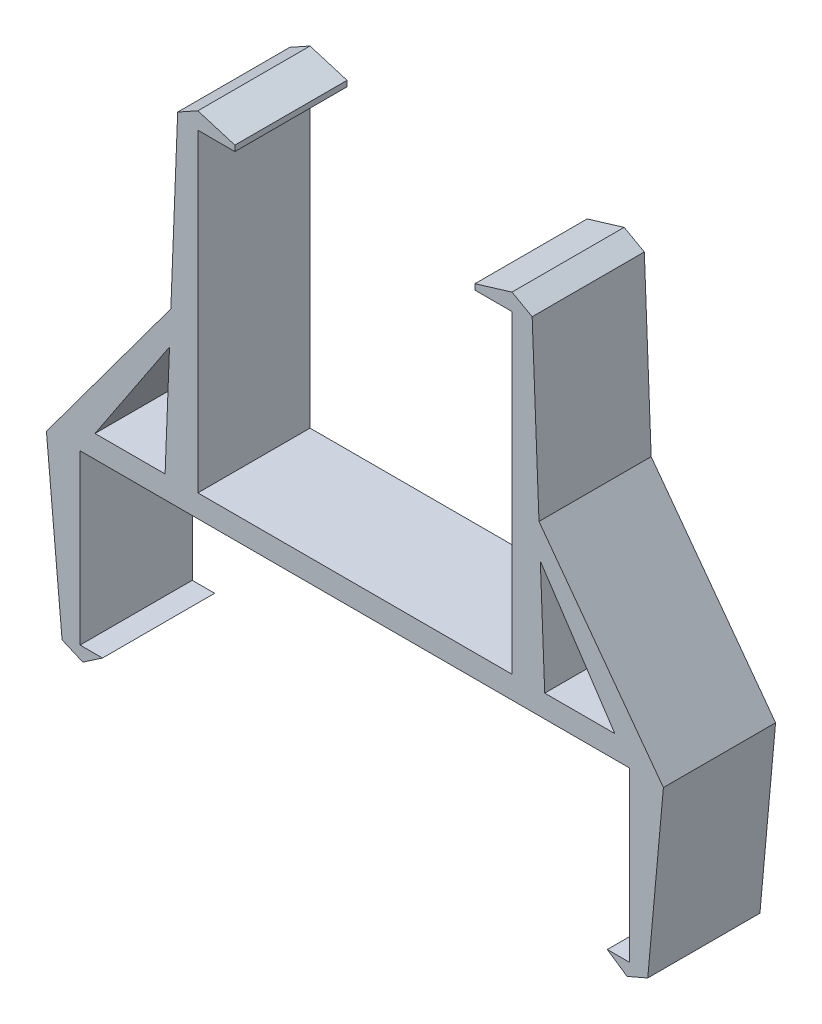
ISO-10303-21;
HEADER;
FILE_DESCRIPTION(('STEP AP214'),'2;1');
FILE_NAME('part.step','',(''),(''),'','','');
FILE_SCHEMA(('AUTOMOTIVE_DESIGN { 1 0 10303 214 1 1 1 1 }'));
ENDSEC;
DATA;
#1=APPLICATION_CONTEXT('core data for automotive mechanical design processes');
#2=APPLICATION_PROTOCOL_DEFINITION('international standard','automotive_design',2000,#1);
#3=PRODUCT_CONTEXT('',#1,'mechanical');
#4=PRODUCT('Part','Part','',(#3));
#5=PRODUCT_RELATED_PRODUCT_CATEGORY('part','',(#4));
#6=PRODUCT_DEFINITION_FORMATION('','',#4);
#7=PRODUCT_DEFINITION_CONTEXT('part definition',#1,'design');
#8=PRODUCT_DEFINITION('design','',#6,#7);
#9=PRODUCT_DEFINITION_SHAPE('','',#8);
#10=(LENGTH_UNIT() NAMED_UNIT(*) SI_UNIT(.MILLI.,.METRE.));
#11=(NAMED_UNIT(*) PLANE_ANGLE_UNIT() SI_UNIT($,.RADIAN.));
#12=(NAMED_UNIT(*) SI_UNIT($,.STERADIAN.) SOLID_ANGLE_UNIT());
#13=UNCERTAINTY_MEASURE_WITH_UNIT(LENGTH_MEASURE(1.E-05),#10,'distance_accuracy_value','');
#14=(GEOMETRIC_REPRESENTATION_CONTEXT(3) GLOBAL_UNCERTAINTY_ASSIGNED_CONTEXT((#13)) GLOBAL_UNIT_ASSIGNED_CONTEXT((#10,
#11,#12)) REPRESENTATION_CONTEXT('',''));
#15=CARTESIAN_POINT('',(0.,0.,0.));
#16=DIRECTION('',(0.,0.,1.));
#17=DIRECTION('',(1.,0.,0.));
#18=AXIS2_PLACEMENT_3D('',#15,#16,#17);
#19=CARTESIAN_POINT('',(30.8735201622857,1.21469587523747,10.));
#20=DIRECTION('',(0.999226911934952,0.0393138457154735,0.));
#21=DIRECTION('',(-0.0393138457154735,0.999226911934952,0.));
#22=AXIS2_PLACEMENT_3D('',#19,#20,#21);
#23=PLANE('',#22);
#24=DIRECTION('',(0.0393138457154735,-0.999226911934952,0.));
#25=VECTOR('',#24,1.);
#26=CARTESIAN_POINT('',(30.8735201622857,1.21469587523747,10.));
#27=LINE('',#26,#25);
#28=CARTESIAN_POINT('',(30.527868852459,10.,10.));
#29=VERTEX_POINT('',#28);
#30=CARTESIAN_POINT('',(30.9213114754098,0.,10.));
#31=VERTEX_POINT('',#30);
#32=EDGE_CURVE('E275',#29,#31,#27,.T.);
#33=ORIENTED_EDGE('',*,*,#32,.T.);
#34=DIRECTION('',(0.,0.,-1.));
#35=VECTOR('',#34,1.);
#36=CARTESIAN_POINT('',(30.9213114754098,0.,10.));
#37=LINE('',#36,#35);
#38=CARTESIAN_POINT('',(30.9213114754098,0.,0.));
#39=VERTEX_POINT('',#38);
#40=EDGE_CURVE('E255',#31,#39,#37,.T.);
#41=ORIENTED_EDGE('',*,*,#40,.T.);
#42=DIRECTION('',(0.0393138457154735,-0.999226911934952,0.));
#43=VECTOR('',#42,1.);
#44=CARTESIAN_POINT('',(30.8735201622857,1.21469587523747,0.));
#45=LINE('',#44,#43);
#46=CARTESIAN_POINT('',(30.527868852459,10.,0.));
#47=VERTEX_POINT('',#46);
#48=EDGE_CURVE('E484',#47,#39,#45,.T.);
#49=ORIENTED_EDGE('',*,*,#48,.F.);
#50=DIRECTION('',(0.,0.,-1.));
#51=VECTOR('',#50,1.);
#52=CARTESIAN_POINT('',(30.527868852459,10.,10.));
#53=LINE('',#52,#51);
#54=EDGE_CURVE('E341',#29,#47,#53,.T.);
#55=ORIENTED_EDGE('',*,*,#54,.F.);
#56=EDGE_LOOP('',(#33,#41,#49,#55));
#57=FACE_BOUND('',#56,.T.);
#58=ADVANCED_FACE('F41',(#57),#23,.T.);
#59=CARTESIAN_POINT('',(25.7891743163955,17.132889986425,10.));
#60=DIRECTION('',(0.832942029592769,0.553360258184376,0.));
#61=DIRECTION('',(-0.553360258184376,0.832942029592769,0.));
#62=AXIS2_PLACEMENT_3D('',#59,#60,#61);
#63=PLANE('',#62);
#64=DIRECTION('',(0.,0.,-1.));
#65=VECTOR('',#64,1.);
#66=CARTESIAN_POINT('',(37.1713114754089,1.49651624892979E-12,10.));
#67=LINE('',#66,#65);
#68=CARTESIAN_POINT('',(37.1713114754089,1.49651624892979E-12,10.));
#69=VERTEX_POINT('',#68);
#70=CARTESIAN_POINT('',(37.1713114754089,1.49651624892979E-12,0.));
#71=VERTEX_POINT('',#70);
#72=EDGE_CURVE('E252',#69,#71,#67,.T.);
#73=ORIENTED_EDGE('',*,*,#72,.F.);
#74=DIRECTION('',(0.553360258184376,-0.832942029592769,0.));
#75=VECTOR('',#74,1.);
#76=CARTESIAN_POINT('',(25.7891743163955,17.132889986425,10.));
#77=LINE('',#76,#75);
#78=EDGE_CURVE('E266',#29,#69,#77,.T.);
#79=ORIENTED_EDGE('',*,*,#78,.F.);
#80=ORIENTED_EDGE('',*,*,#54,.T.);
#81=DIRECTION('',(0.553360258184376,-0.832942029592769,0.));
#82=VECTOR('',#81,1.);
#83=CARTESIAN_POINT('',(25.7891743163955,17.132889986425,0.));
#84=LINE('',#83,#82);
#85=EDGE_CURVE('E269',#47,#71,#84,.T.);
#86=ORIENTED_EDGE('',*,*,#85,.T.);
#87=EDGE_LOOP('',(#73,#79,#80,#86));
#88=FACE_BOUND('',#87,.T.);
#89=ADVANCED_FACE('F265',(#88),#63,.F.);
#90=CARTESIAN_POINT('',(29.8,28.5,10.));
#91=VERTEX_POINT('',#90);
#92=CARTESIAN_POINT('',(30.4098360655738,13.,10.));
#93=VERTEX_POINT('',#92);
#94=EDGE_CURVE('E433',#91,#93,#27,.T.);
#95=ORIENTED_EDGE('',*,*,#94,.T.);
#96=DIRECTION('',(0.,0.,-1.));
#97=VECTOR('',#96,1.);
#98=CARTESIAN_POINT('',(30.4098360655738,13.,10.));
#99=LINE('',#98,#97);
#100=CARTESIAN_POINT('',(30.4098360655738,13.,0.));
#101=VERTEX_POINT('',#100);
#102=EDGE_CURVE('E344',#93,#101,#99,.T.);
#103=ORIENTED_EDGE('',*,*,#102,.T.);
#104=CARTESIAN_POINT('',(29.8,28.5,0.));
#105=VERTEX_POINT('',#104);
#106=EDGE_CURVE('E485',#105,#101,#45,.T.);
#107=ORIENTED_EDGE('',*,*,#106,.F.);
#108=DIRECTION('',(0.,0.,-1.));
#109=VECTOR('',#108,1.);
#110=CARTESIAN_POINT('',(29.8,28.5,10.));
#111=LINE('',#110,#109);
#112=EDGE_CURVE('E11',#91,#105,#111,.T.);
#113=ORIENTED_EDGE('',*,*,#112,.F.);
#114=EDGE_LOOP('',(#95,#103,#107,#113));
#115=FACE_BOUND('',#114,.T.);
#116=ADVANCED_FACE('F591',(#115),#23,.T.);
#117=CARTESIAN_POINT('',(-2.91679635930406,0.114759201021799,10.));
#118=DIRECTION('',(0.999226911934952,-0.0393138457154735,0.));
#119=DIRECTION('',(0.0393138457154735,0.999226911934952,0.));
#120=AXIS2_PLACEMENT_3D('',#117,#118,#119);
#121=PLANE('',#120);
#122=DIRECTION('',(0.,0.,-1.));
#123=VECTOR('',#122,1.);
#124=CARTESIAN_POINT('',(-2.40983606557377,13.,10.));
#125=LINE('',#124,#123);
#126=CARTESIAN_POINT('',(-2.40983606557377,13.,10.));
#127=VERTEX_POINT('',#126);
#128=CARTESIAN_POINT('',(-2.40983606557377,13.,0.));
#129=VERTEX_POINT('',#128);
#130=EDGE_CURVE('E404',#127,#129,#125,.T.);
#131=ORIENTED_EDGE('',*,*,#130,.F.);
#132=DIRECTION('',(-0.0393138457154735,-0.999226911934952,0.));
#133=VECTOR('',#132,1.);
#134=CARTESIAN_POINT('',(-2.91679635930406,0.114759201021799,10.));
#135=LINE('',#134,#133);
#136=CARTESIAN_POINT('',(-1.8,28.5,10.));
#137=VERTEX_POINT('',#136);
#138=EDGE_CURVE('E477',#137,#127,#135,.T.);
#139=ORIENTED_EDGE('',*,*,#138,.F.);
#140=DIRECTION('',(0.,0.,-1.));
#141=VECTOR('',#140,1.);
#142=CARTESIAN_POINT('',(-1.8,28.5,10.));
#143=LINE('',#142,#141);
#144=CARTESIAN_POINT('',(-1.8,28.5,0.));
#145=VERTEX_POINT('',#144);
#146=EDGE_CURVE('E481',#137,#145,#143,.T.);
#147=ORIENTED_EDGE('',*,*,#146,.T.);
#148=DIRECTION('',(-0.0393138457154735,-0.999226911934952,0.));
#149=VECTOR('',#148,1.);
#150=CARTESIAN_POINT('',(-2.91679635930406,0.114759201021799,0.));
#151=LINE('',#150,#149);
#152=EDGE_CURVE('E432',#145,#129,#151,.T.);
#153=ORIENTED_EDGE('',*,*,#152,.T.);
#154=EDGE_LOOP('',(#131,#139,#147,#153));
#155=FACE_BOUND('',#154,.T.);
#156=ADVANCED_FACE('F648',(#155),#121,.F.);
#157=CARTESIAN_POINT('',(0.,-2.,10.));
#158=DIRECTION('',(0.,1.,0.));
#159=DIRECTION('',(0.,0.,1.));
#160=AXIS2_PLACEMENT_3D('',#157,#158,#159);
#161=PLANE('',#160);
#162=DIRECTION('',(1.,0.,0.));
#163=VECTOR('',#162,1.);
#164=CARTESIAN_POINT('',(0.,-2.,0.));
#165=LINE('',#164,#163);
#166=CARTESIAN_POINT('',(-10.5,-2.,0.));
#167=VERTEX_POINT('',#166);
#168=CARTESIAN_POINT('',(38.5,-1.99999999999999,0.));
#169=VERTEX_POINT('',#168);
#170=EDGE_CURVE('E428',#167,#169,#165,.T.);
#171=ORIENTED_EDGE('',*,*,#170,.T.);
#172=DIRECTION('',(0.,0.,-1.));
#173=VECTOR('',#172,1.);
#174=CARTESIAN_POINT('',(38.5,-1.99999999999999,10.));
#175=LINE('',#174,#173);
#176=CARTESIAN_POINT('',(38.5,-1.99999999999999,10.));
#177=VERTEX_POINT('',#176);
#178=EDGE_CURVE('E337',#177,#169,#175,.T.);
#179=ORIENTED_EDGE('',*,*,#178,.F.);
#180=DIRECTION('',(1.,0.,0.));
#181=VECTOR('',#180,1.);
#182=CARTESIAN_POINT('',(0.,-2.,10.));
#183=LINE('',#182,#181);
#184=CARTESIAN_POINT('',(-10.5,-2.,10.));
#185=VERTEX_POINT('',#184);
#186=EDGE_CURVE('E429',#185,#177,#183,.T.);
#187=ORIENTED_EDGE('',*,*,#186,.F.);
#188=DIRECTION('',(0.,0.,-1.));
#189=VECTOR('',#188,1.);
#190=CARTESIAN_POINT('',(-10.5,-2.,10.));
#191=LINE('',#190,#189);
#192=EDGE_CURVE('E410',#185,#167,#191,.T.);
#193=ORIENTED_EDGE('',*,*,#192,.T.);
#194=EDGE_LOOP('',(#171,#179,#187,#193));
#195=FACE_BOUND('',#194,.T.);
#196=ADVANCED_FACE('F43',(#195),#161,.F.);
#197=CARTESIAN_POINT('',(19.127358490566,34.4292452830189,10.));
#198=DIRECTION('',(-0.485642931178631,-0.874157276121539,0.));
#199=DIRECTION('',(0.874157276121539,-0.485642931178631,0.));
#200=AXIS2_PLACEMENT_3D('',#197,#198,#199);
#201=PLANE('',#200);
#202=DIRECTION('',(-0.874157276121539,0.485642931178631,0.));
#203=VECTOR('',#202,1.);
#204=CARTESIAN_POINT('',(19.127358490566,34.4292452830189,0.));
#205=LINE('',#204,#203);
#206=CARTESIAN_POINT('',(28.,29.5,0.));
#207=VERTEX_POINT('',#206);
#208=EDGE_CURVE('E489',#105,#207,#205,.T.);
#209=ORIENTED_EDGE('',*,*,#208,.T.);
#210=DIRECTION('',(0.,0.,-1.));
#211=VECTOR('',#210,1.);
#212=CARTESIAN_POINT('',(28.,29.5,10.));
#213=LINE('',#212,#211);
#214=CARTESIAN_POINT('',(28.,29.5,10.));
#215=VERTEX_POINT('',#214);
#216=EDGE_CURVE('E50',#215,#207,#213,.T.);
#217=ORIENTED_EDGE('',*,*,#216,.F.);
#218=DIRECTION('',(-0.874157276121539,0.485642931178631,0.));
#219=VECTOR('',#218,1.);
#220=CARTESIAN_POINT('',(19.127358490566,34.4292452830189,10.));
#221=LINE('',#220,#219);
#222=EDGE_CURVE('E437',#91,#215,#221,.T.);
#223=ORIENTED_EDGE('',*,*,#222,.F.);
#224=ORIENTED_EDGE('',*,*,#112,.T.);
#225=EDGE_LOOP('',(#209,#217,#223,#224));
#226=FACE_BOUND('',#225,.T.);
#227=ADVANCED_FACE('F573',(#226),#201,.F.);
#228=CARTESIAN_POINT('',(-5.83263246425568,19.2476871320437,10.));
#229=DIRECTION('',(-0.290007395282871,0.957024404433473,0.));
#230=DIRECTION('',(-0.957024404433473,-0.290007395282871,0.));
#231=AXIS2_PLACEMENT_3D('',#228,#229,#230);
#232=PLANE('',#231);
#233=DIRECTION('',(0.957024404433473,0.290007395282871,0.));
#234=VECTOR('',#233,1.);
#235=CARTESIAN_POINT('',(-5.83263246425568,19.2476871320437,0.));
#236=LINE('',#235,#234);
#237=CARTESIAN_POINT('',(24.7,28.5,0.));
#238=VERTEX_POINT('',#237);
#239=EDGE_CURVE('E493',#238,#207,#236,.T.);
#240=ORIENTED_EDGE('',*,*,#239,.F.);
#241=DIRECTION('',(0.,0.,-1.));
#242=VECTOR('',#241,1.);
#243=CARTESIAN_POINT('',(24.7,28.5,10.));
#244=LINE('',#243,#242);
#245=CARTESIAN_POINT('',(24.7,28.5,10.));
#246=VERTEX_POINT('',#245);
#247=EDGE_CURVE('E562',#246,#238,#244,.T.);
#248=ORIENTED_EDGE('',*,*,#247,.F.);
#249=DIRECTION('',(0.957024404433473,0.290007395282871,0.));
#250=VECTOR('',#249,1.);
#251=CARTESIAN_POINT('',(-5.83263246425568,19.2476871320437,10.));
#252=LINE('',#251,#250);
#253=EDGE_CURVE('E440',#246,#215,#252,.T.);
#254=ORIENTED_EDGE('',*,*,#253,.T.);
#255=ORIENTED_EDGE('',*,*,#216,.T.);
#256=EDGE_LOOP('',(#240,#248,#254,#255));
#257=FACE_BOUND('',#256,.T.);
#258=ADVANCED_FACE('F568',(#257),#232,.T.);
#259=CARTESIAN_POINT('',(24.7,0.,10.));
#260=DIRECTION('',(-1.,0.,0.));
#261=DIRECTION('',(0.,0.,1.));
#262=AXIS2_PLACEMENT_3D('',#259,#260,#261);
#263=PLANE('',#262);
#264=DIRECTION('',(0.,1.,0.));
#265=VECTOR('',#264,1.);
#266=CARTESIAN_POINT('',(24.7,0.,0.));
#267=LINE('',#266,#265);
#268=CARTESIAN_POINT('',(24.7,28.,0.));
#269=VERTEX_POINT('',#268);
#270=EDGE_CURVE('E497',#269,#238,#267,.T.);
#271=ORIENTED_EDGE('',*,*,#270,.F.);
#272=DIRECTION('',(0.,0.,-1.));
#273=VECTOR('',#272,1.);
#274=CARTESIAN_POINT('',(24.7,28.,10.));
#275=LINE('',#274,#273);
#276=CARTESIAN_POINT('',(24.7,28.,10.));
#277=VERTEX_POINT('',#276);
#278=EDGE_CURVE('E559',#277,#269,#275,.T.);
#279=ORIENTED_EDGE('',*,*,#278,.F.);
#280=DIRECTION('',(0.,1.,0.));
#281=VECTOR('',#280,1.);
#282=CARTESIAN_POINT('',(24.7,0.,10.));
#283=LINE('',#282,#281);
#284=EDGE_CURVE('E444',#277,#246,#283,.T.);
#285=ORIENTED_EDGE('',*,*,#284,.T.);
#286=ORIENTED_EDGE('',*,*,#247,.T.);
#287=EDGE_LOOP('',(#271,#279,#285,#286));
#288=FACE_BOUND('',#287,.T.);
#289=ADVANCED_FACE('F582',(#288),#263,.T.);
#290=CARTESIAN_POINT('',(0.,28.,10.));
#291=DIRECTION('',(0.,-1.,0.));
#292=DIRECTION('',(1.,0.,0.));
#293=AXIS2_PLACEMENT_3D('',#290,#291,#292);
#294=PLANE('',#293);
#295=DIRECTION('',(-1.,0.,0.));
#296=VECTOR('',#295,1.);
#297=CARTESIAN_POINT('',(0.,28.,0.));
#298=LINE('',#297,#296);
#299=CARTESIAN_POINT('',(28.,28.,0.));
#300=VERTEX_POINT('',#299);
#301=EDGE_CURVE('E501',#300,#269,#298,.T.);
#302=ORIENTED_EDGE('',*,*,#301,.F.);
#303=DIRECTION('',(0.,0.,-1.));
#304=VECTOR('',#303,1.);
#305=CARTESIAN_POINT('',(28.,28.,10.));
#306=LINE('',#305,#304);
#307=CARTESIAN_POINT('',(28.,28.,10.));
#308=VERTEX_POINT('',#307);
#309=EDGE_CURVE('E556',#308,#300,#306,.T.);
#310=ORIENTED_EDGE('',*,*,#309,.F.);
#311=DIRECTION('',(-1.,0.,0.));
#312=VECTOR('',#311,1.);
#313=CARTESIAN_POINT('',(0.,28.,10.));
#314=LINE('',#313,#312);
#315=EDGE_CURVE('E448',#308,#277,#314,.T.);
#316=ORIENTED_EDGE('',*,*,#315,.T.);
#317=ORIENTED_EDGE('',*,*,#278,.T.);
#318=EDGE_LOOP('',(#302,#310,#316,#317));
#319=FACE_BOUND('',#318,.T.);
#320=ADVANCED_FACE('F681',(#319),#294,.T.);
#321=CARTESIAN_POINT('',(28.,0.,10.));
#322=DIRECTION('',(-1.,0.,0.));
#323=DIRECTION('',(0.,0.,1.));
#324=AXIS2_PLACEMENT_3D('',#321,#322,#323);
#325=PLANE('',#324);
#326=DIRECTION('',(0.,1.,0.));
#327=VECTOR('',#326,1.);
#328=CARTESIAN_POINT('',(28.,0.,0.));
#329=LINE('',#328,#327);
#330=CARTESIAN_POINT('',(28.,0.,0.));
#331=VERTEX_POINT('',#330);
#332=EDGE_CURVE('E505',#331,#300,#329,.T.);
#333=ORIENTED_EDGE('',*,*,#332,.F.);
#334=DIRECTION('',(0.,0.,-1.));
#335=VECTOR('',#334,1.);
#336=CARTESIAN_POINT('',(28.,0.,10.));
#337=LINE('',#336,#335);
#338=CARTESIAN_POINT('',(28.,0.,10.));
#339=VERTEX_POINT('',#338);
#340=EDGE_CURVE('E553',#339,#331,#337,.T.);
#341=ORIENTED_EDGE('',*,*,#340,.F.);
#342=DIRECTION('',(0.,1.,0.));
#343=VECTOR('',#342,1.);
#344=CARTESIAN_POINT('',(28.,0.,10.));
#345=LINE('',#344,#343);
#346=EDGE_CURVE('E452',#339,#308,#345,.T.);
#347=ORIENTED_EDGE('',*,*,#346,.T.);
#348=ORIENTED_EDGE('',*,*,#309,.T.);
#349=EDGE_LOOP('',(#333,#341,#347,#348));
#350=FACE_BOUND('',#349,.T.);
#351=ADVANCED_FACE('F679',(#350),#325,.T.);
#352=CARTESIAN_POINT('',(0.,0.,10.));
#353=DIRECTION('',(0.,1.,0.));
#354=DIRECTION('',(0.,0.,1.));
#355=AXIS2_PLACEMENT_3D('',#352,#353,#354);
#356=PLANE('',#355);
#357=DIRECTION('',(1.,0.,0.));
#358=VECTOR('',#357,1.);
#359=CARTESIAN_POINT('',(0.,0.,0.));
#360=LINE('',#359,#358);
#361=CARTESIAN_POINT('',(0.,0.,0.));
#362=VERTEX_POINT('',#361);
#363=EDGE_CURVE('E509',#362,#331,#360,.T.);
#364=ORIENTED_EDGE('',*,*,#363,.F.);
#365=DIRECTION('',(0.,0.,-1.));
#366=VECTOR('',#365,1.);
#367=CARTESIAN_POINT('',(0.,0.,10.));
#368=LINE('',#367,#366);
#369=CARTESIAN_POINT('',(0.,0.,10.));
#370=VERTEX_POINT('',#369);
#371=EDGE_CURVE('E550',#370,#362,#368,.T.);
#372=ORIENTED_EDGE('',*,*,#371,.F.);
#373=DIRECTION('',(1.,0.,0.));
#374=VECTOR('',#373,1.);
#375=CARTESIAN_POINT('',(0.,0.,10.));
#376=LINE('',#375,#374);
#377=EDGE_CURVE('E456',#370,#339,#376,.T.);
#378=ORIENTED_EDGE('',*,*,#377,.T.);
#379=ORIENTED_EDGE('',*,*,#340,.T.);
#380=EDGE_LOOP('',(#364,#372,#378,#379));
#381=FACE_BOUND('',#380,.T.);
#382=ADVANCED_FACE('F673',(#381),#356,.T.);
#383=CARTESIAN_POINT('',(0.,0.,10.));
#384=DIRECTION('',(-1.,0.,0.));
#385=DIRECTION('',(0.,0.,1.));
#386=AXIS2_PLACEMENT_3D('',#383,#384,#385);
#387=PLANE('',#386);
#388=DIRECTION('',(0.,1.,0.));
#389=VECTOR('',#388,1.);
#390=CARTESIAN_POINT('',(0.,0.,0.));
#391=LINE('',#390,#389);
#392=CARTESIAN_POINT('',(0.,28.,0.));
#393=VERTEX_POINT('',#392);
#394=EDGE_CURVE('E513',#362,#393,#391,.T.);
#395=ORIENTED_EDGE('',*,*,#394,.T.);
#396=DIRECTION('',(0.,0.,-1.));
#397=VECTOR('',#396,1.);
#398=CARTESIAN_POINT('',(0.,28.,10.));
#399=LINE('',#398,#397);
#400=CARTESIAN_POINT('',(0.,28.,10.));
#401=VERTEX_POINT('',#400);
#402=EDGE_CURVE('E546',#401,#393,#399,.T.);
#403=ORIENTED_EDGE('',*,*,#402,.F.);
#404=DIRECTION('',(0.,1.,0.));
#405=VECTOR('',#404,1.);
#406=CARTESIAN_POINT('',(0.,0.,10.));
#407=LINE('',#406,#405);
#408=EDGE_CURVE('E460',#370,#401,#407,.T.);
#409=ORIENTED_EDGE('',*,*,#408,.F.);
#410=ORIENTED_EDGE('',*,*,#371,.T.);
#411=EDGE_LOOP('',(#395,#403,#409,#410));
#412=FACE_BOUND('',#411,.T.);
#413=ADVANCED_FACE('F682',(#412),#387,.F.);
#414=CARTESIAN_POINT('',(0.,28.,10.));
#415=DIRECTION('',(0.,1.,0.));
#416=DIRECTION('',(0.,0.,1.));
#417=AXIS2_PLACEMENT_3D('',#414,#415,#416);
#418=PLANE('',#417);
#419=DIRECTION('',(1.,0.,0.));
#420=VECTOR('',#419,1.);
#421=CARTESIAN_POINT('',(0.,28.,0.));
#422=LINE('',#421,#420);
#423=CARTESIAN_POINT('',(3.3,28.,0.));
#424=VERTEX_POINT('',#423);
#425=EDGE_CURVE('E516',#393,#424,#422,.T.);
#426=ORIENTED_EDGE('',*,*,#425,.T.);
#427=DIRECTION('',(0.,0.,-1.));
#428=VECTOR('',#427,1.);
#429=CARTESIAN_POINT('',(3.3,28.,10.));
#430=LINE('',#429,#428);
#431=CARTESIAN_POINT('',(3.3,28.,10.));
#432=VERTEX_POINT('',#431);
#433=EDGE_CURVE('E542',#432,#424,#430,.T.);
#434=ORIENTED_EDGE('',*,*,#433,.F.);
#435=DIRECTION('',(1.,0.,0.));
#436=VECTOR('',#435,1.);
#437=CARTESIAN_POINT('',(0.,28.,10.));
#438=LINE('',#437,#436);
#439=EDGE_CURVE('E463',#401,#432,#438,.T.);
#440=ORIENTED_EDGE('',*,*,#439,.F.);
#441=ORIENTED_EDGE('',*,*,#402,.T.);
#442=EDGE_LOOP('',(#426,#434,#440,#441));
#443=FACE_BOUND('',#442,.T.);
#444=ADVANCED_FACE('F667',(#443),#418,.F.);
#445=CARTESIAN_POINT('',(3.3,0.,10.));
#446=DIRECTION('',(-1.,0.,0.));
#447=DIRECTION('',(0.,0.,1.));
#448=AXIS2_PLACEMENT_3D('',#445,#446,#447);
#449=PLANE('',#448);
#450=DIRECTION('',(0.,1.,0.));
#451=VECTOR('',#450,1.);
#452=CARTESIAN_POINT('',(3.3,0.,0.));
#453=LINE('',#452,#451);
#454=CARTESIAN_POINT('',(3.3,28.5,0.));
#455=VERTEX_POINT('',#454);
#456=EDGE_CURVE('E519',#424,#455,#453,.T.);
#457=ORIENTED_EDGE('',*,*,#456,.T.);
#458=DIRECTION('',(0.,0.,-1.));
#459=VECTOR('',#458,1.);
#460=CARTESIAN_POINT('',(3.3,28.5,10.));
#461=LINE('',#460,#459);
#462=CARTESIAN_POINT('',(3.3,28.5,10.));
#463=VERTEX_POINT('',#462);
#464=EDGE_CURVE('E538',#463,#455,#461,.T.);
#465=ORIENTED_EDGE('',*,*,#464,.F.);
#466=DIRECTION('',(0.,1.,0.));
#467=VECTOR('',#466,1.);
#468=CARTESIAN_POINT('',(3.3,0.,10.));
#469=LINE('',#468,#467);
#470=EDGE_CURVE('E466',#432,#463,#469,.T.);
#471=ORIENTED_EDGE('',*,*,#470,.F.);
#472=ORIENTED_EDGE('',*,*,#433,.T.);
#473=EDGE_LOOP('',(#457,#465,#471,#472));
#474=FACE_BOUND('',#473,.T.);
#475=ADVANCED_FACE('F663',(#474),#449,.F.);
#476=CARTESIAN_POINT('',(8.18755256518081,27.0189234650967,10.));
#477=DIRECTION('',(-0.29000739528287,-0.957024404433474,0.));
#478=DIRECTION('',(0.957024404433474,-0.29000739528287,0.));
#479=AXIS2_PLACEMENT_3D('',#476,#477,#478);
#480=PLANE('',#479);
#481=DIRECTION('',(-0.957024404433474,0.29000739528287,0.));
#482=VECTOR('',#481,1.);
#483=CARTESIAN_POINT('',(8.18755256518081,27.0189234650967,0.));
#484=LINE('',#483,#482);
#485=CARTESIAN_POINT('',(0.,29.5,0.));
#486=VERTEX_POINT('',#485);
#487=EDGE_CURVE('E522',#455,#486,#484,.T.);
#488=ORIENTED_EDGE('',*,*,#487,.T.);
#489=DIRECTION('',(0.,0.,-1.));
#490=VECTOR('',#489,1.);
#491=CARTESIAN_POINT('',(0.,29.5,10.));
#492=LINE('',#491,#490);
#493=CARTESIAN_POINT('',(0.,29.5,10.));
#494=VERTEX_POINT('',#493);
#495=EDGE_CURVE('E535',#494,#486,#492,.T.);
#496=ORIENTED_EDGE('',*,*,#495,.F.);
#497=DIRECTION('',(-0.957024404433474,0.29000739528287,0.));
#498=VECTOR('',#497,1.);
#499=CARTESIAN_POINT('',(8.18755256518081,27.0189234650967,10.));
#500=LINE('',#499,#498);
#501=EDGE_CURVE('E469',#463,#494,#500,.T.);
#502=ORIENTED_EDGE('',*,*,#501,.F.);
#503=ORIENTED_EDGE('',*,*,#464,.T.);
#504=EDGE_LOOP('',(#488,#496,#502,#503));
#505=FACE_BOUND('',#504,.T.);
#506=ADVANCED_FACE('F659',(#505),#480,.F.);
#507=CARTESIAN_POINT('',(-12.5235849056604,22.5424528301887,10.));
#508=DIRECTION('',(-0.485642931178631,0.874157276121538,0.));
#509=DIRECTION('',(-0.874157276121538,-0.485642931178631,0.));
#510=AXIS2_PLACEMENT_3D('',#507,#508,#509);
#511=PLANE('',#510);
#512=DIRECTION('',(0.874157276121538,0.485642931178631,0.));
#513=VECTOR('',#512,1.);
#514=CARTESIAN_POINT('',(-12.5235849056604,22.5424528301887,0.));
#515=LINE('',#514,#513);
#516=EDGE_CURVE('E526',#145,#486,#515,.T.);
#517=ORIENTED_EDGE('',*,*,#516,.F.);
#518=ORIENTED_EDGE('',*,*,#146,.F.);
#519=DIRECTION('',(0.874157276121538,0.485642931178631,0.));
#520=VECTOR('',#519,1.);
#521=CARTESIAN_POINT('',(-12.5235849056604,22.5424528301887,10.));
#522=LINE('',#521,#520);
#523=EDGE_CURVE('E472',#137,#494,#522,.T.);
#524=ORIENTED_EDGE('',*,*,#523,.T.);
#525=ORIENTED_EDGE('',*,*,#495,.T.);
#526=EDGE_LOOP('',(#517,#518,#524,#525));
#527=FACE_BOUND('',#526,.T.);
#528=ADVANCED_FACE('F654',(#527),#511,.T.);
#529=CARTESIAN_POINT('',(-2.52786885245902,10.,0.));
#530=VERTEX_POINT('',#529);
#531=CARTESIAN_POINT('',(-2.92131147540984,0.,0.));
#532=VERTEX_POINT('',#531);
#533=EDGE_CURVE('E62',#530,#532,#151,.T.);
#534=ORIENTED_EDGE('',*,*,#533,.T.);
#535=DIRECTION('',(0.,0.,-1.));
#536=VECTOR('',#535,1.);
#537=CARTESIAN_POINT('',(-2.92131147540984,0.,10.));
#538=LINE('',#537,#536);
#539=CARTESIAN_POINT('',(-2.92131147540984,0.,10.));
#540=VERTEX_POINT('',#539);
#541=EDGE_CURVE('E57',#540,#532,#538,.T.);
#542=ORIENTED_EDGE('',*,*,#541,.F.);
#543=CARTESIAN_POINT('',(-2.52786885245902,10.,10.));
#544=VERTEX_POINT('',#543);
#545=EDGE_CURVE('E476',#544,#540,#135,.T.);
#546=ORIENTED_EDGE('',*,*,#545,.F.);
#547=DIRECTION('',(0.,0.,-1.));
#548=VECTOR('',#547,1.);
#549=CARTESIAN_POINT('',(-2.52786885245902,10.,10.));
#550=LINE('',#549,#548);
#551=EDGE_CURVE('E407',#544,#530,#550,.T.);
#552=ORIENTED_EDGE('',*,*,#551,.T.);
#553=EDGE_LOOP('',(#534,#542,#546,#552));
#554=FACE_BOUND('',#553,.T.);
#555=ADVANCED_FACE('F703',(#554),#121,.F.);
#556=CARTESIAN_POINT('',(0.,0.,10.));
#557=DIRECTION('',(0.,0.,1.));
#558=DIRECTION('',(1.,0.,0.));
#559=AXIS2_PLACEMENT_3D('',#556,#557,#558);
#560=PLANE('',#559);
#561=ORIENTED_EDGE('',*,*,#186,.T.);
#562=DIRECTION('',(0.,-1.,0.));
#563=VECTOR('',#562,1.);
#564=CARTESIAN_POINT('',(38.5,0.,10.));
#565=LINE('',#564,#563);
#566=CARTESIAN_POINT('',(38.5,-17.,10.));
#567=VERTEX_POINT('',#566);
#568=EDGE_CURVE('E277',#177,#567,#565,.T.);
#569=ORIENTED_EDGE('',*,*,#568,.T.);
#570=DIRECTION('',(1.,0.,0.));
#571=VECTOR('',#570,1.);
#572=CARTESIAN_POINT('',(0.,-17.0000000000001,10.));
#573=LINE('',#572,#571);
#574=CARTESIAN_POINT('',(36.5,-17.,10.));
#575=VERTEX_POINT('',#574);
#576=EDGE_CURVE('E282',#575,#567,#573,.T.);
#577=ORIENTED_EDGE('',*,*,#576,.F.);
#578=DIRECTION('',(-0.825919007607792,0.563788783918376,0.));
#579=VECTOR('',#578,1.);
#580=CARTESIAN_POINT('',(3.68586360029131,5.39958384019753,10.));
#581=LINE('',#580,#579);
#582=CARTESIAN_POINT('',(38.2579328241351,-18.2,10.));
#583=VERTEX_POINT('',#582);
#584=EDGE_CURVE('E291',#583,#575,#581,.T.);
#585=ORIENTED_EDGE('',*,*,#584,.F.);
#586=DIRECTION('',(-0.917647420888673,-0.397395534620567,0.));
#587=VECTOR('',#586,1.);
#588=CARTESIAN_POINT('',(12.678791166369,-29.2772791846122,10.));
#589=LINE('',#588,#587);
#590=CARTESIAN_POINT('',(40.1052558883258,-17.4,10.));
#591=VERTEX_POINT('',#590);
#592=EDGE_CURVE('E295',#591,#583,#589,.T.);
#593=ORIENTED_EDGE('',*,*,#592,.F.);
#594=DIRECTION('',(-0.090198626647116,-0.995923796156601,0.));
#595=VECTOR('',#594,1.);
#596=CARTESIAN_POINT('',(41.3420265389824,-3.74425636882611,10.));
#597=LINE('',#596,#595);
#598=CARTESIAN_POINT('',(41.5,-2.,10.));
#599=VERTEX_POINT('',#598);
#600=EDGE_CURVE('E284',#599,#591,#597,.T.);
#601=ORIENTED_EDGE('',*,*,#600,.F.);
#602=DIRECTION('',(-0.594502247198175,0.804093948538553,0.));
#603=VECTOR('',#602,1.);
#604=CARTESIAN_POINT('',(25.876462421438,19.1316140197845,10.));
#605=LINE('',#604,#603);
#606=EDGE_CURVE('E278',#599,#93,#605,.T.);
#607=ORIENTED_EDGE('',*,*,#606,.T.);
#608=ORIENTED_EDGE('',*,*,#94,.F.);
#609=ORIENTED_EDGE('',*,*,#222,.T.);
#610=ORIENTED_EDGE('',*,*,#253,.F.);
#611=ORIENTED_EDGE('',*,*,#284,.F.);
#612=ORIENTED_EDGE('',*,*,#315,.F.);
#613=ORIENTED_EDGE('',*,*,#346,.F.);
#614=ORIENTED_EDGE('',*,*,#377,.F.);
#615=ORIENTED_EDGE('',*,*,#408,.T.);
#616=ORIENTED_EDGE('',*,*,#439,.T.);
#617=ORIENTED_EDGE('',*,*,#470,.T.);
#618=ORIENTED_EDGE('',*,*,#501,.T.);
#619=ORIENTED_EDGE('',*,*,#523,.F.);
#620=ORIENTED_EDGE('',*,*,#138,.T.);
#621=DIRECTION('',(0.594502247198175,0.804093948538552,0.));
#622=VECTOR('',#621,1.);
#623=CARTESIAN_POINT('',(-7.77258423530107,5.74661555757505,10.));
#624=LINE('',#623,#622);
#625=CARTESIAN_POINT('',(-13.5,-2.,10.));
#626=VERTEX_POINT('',#625);
#627=EDGE_CURVE('E374',#626,#127,#624,.T.);
#628=ORIENTED_EDGE('',*,*,#627,.F.);
#629=DIRECTION('',(-0.0901986266471216,0.9959237961566,0.));
#630=VECTOR('',#629,1.);
#631=CARTESIAN_POINT('',(-13.5698287219552,-1.22898952638798,10.));
#632=LINE('',#631,#630);
#633=CARTESIAN_POINT('',(-12.1052558883258,-17.4,10.));
#634=VERTEX_POINT('',#633);
#635=EDGE_CURVE('E352',#634,#626,#632,.T.);
#636=ORIENTED_EDGE('',*,*,#635,.F.);
#637=DIRECTION('',(0.917647420888673,-0.397395534620567,0.));
#638=VECTOR('',#637,1.);
#639=CARTESIAN_POINT('',(-8.25694126015072,-19.0665475369296,10.));
#640=LINE('',#639,#638);
#641=CARTESIAN_POINT('',(-10.2579328241351,-18.2,10.));
#642=VERTEX_POINT('',#641);
#643=EDGE_CURVE('E356',#634,#642,#640,.T.);
#644=ORIENTED_EDGE('',*,*,#643,.T.);
#645=DIRECTION('',(0.825919007607791,0.563788783918377,0.));
#646=VECTOR('',#645,1.);
#647=CARTESIAN_POINT('',(5.21415460012919,-7.63844460140196,10.));
#648=LINE('',#647,#646);
#649=CARTESIAN_POINT('',(-8.49999999999999,-17.,10.));
#650=VERTEX_POINT('',#649);
#651=EDGE_CURVE('E360',#642,#650,#648,.T.);
#652=ORIENTED_EDGE('',*,*,#651,.T.);
#653=DIRECTION('',(-1.,0.,0.));
#654=VECTOR('',#653,1.);
#655=CARTESIAN_POINT('',(0.,-17.,10.));
#656=LINE('',#655,#654);
#657=CARTESIAN_POINT('',(-10.5,-17.,10.));
#658=VERTEX_POINT('',#657);
#659=EDGE_CURVE('E363',#650,#658,#656,.T.);
#660=ORIENTED_EDGE('',*,*,#659,.T.);
#661=DIRECTION('',(0.,-1.,0.));
#662=VECTOR('',#661,1.);
#663=CARTESIAN_POINT('',(-10.5,0.,10.));
#664=LINE('',#663,#662);
#665=EDGE_CURVE('E366',#185,#658,#664,.T.);
#666=ORIENTED_EDGE('',*,*,#665,.F.);
#667=EDGE_LOOP('',(#561,#569,#577,#585,#593,#601,#607,#608,#609,#610,#611,#612,#613,#614,#615,
#616,#617,#618,#619,#620,#628,#636,#644,#652,#660,#666));
#668=FACE_BOUND('',#667,.T.);
#669=DIRECTION('',(-1.,0.,0.));
#670=VECTOR('',#669,1.);
#671=CARTESIAN_POINT('',(0.,0.,10.));
#672=LINE('',#671,#670);
#673=EDGE_CURVE('E249',#69,#31,#672,.T.);
#674=ORIENTED_EDGE('',*,*,#673,.T.);
#675=ORIENTED_EDGE('',*,*,#32,.F.);
#676=ORIENTED_EDGE('',*,*,#78,.T.);
#677=EDGE_LOOP('',(#674,#675,#676));
#678=FACE_BOUND('',#677,.T.);
#679=ORIENTED_EDGE('',*,*,#545,.T.);
#680=DIRECTION('',(1.,0.,0.));
#681=VECTOR('',#680,1.);
#682=CARTESIAN_POINT('',(0.,0.,10.));
#683=LINE('',#682,#681);
#684=CARTESIAN_POINT('',(-9.17131147540958,3.69512597812077E-13,10.));
#685=VERTEX_POINT('',#684);
#686=EDGE_CURVE('E938',#685,#540,#683,.T.);
#687=ORIENTED_EDGE('',*,*,#686,.F.);
#688=DIRECTION('',(-0.553360258184376,-0.832942029592769,0.));
#689=VECTOR('',#688,1.);
#690=CARTESIAN_POINT('',(-6.36298642585612,4.227213523079,10.));
#691=LINE('',#690,#689);
#692=EDGE_CURVE('E370',#544,#685,#691,.T.);
#693=ORIENTED_EDGE('',*,*,#692,.F.);
#694=EDGE_LOOP('',(#679,#687,#693));
#695=FACE_BOUND('',#694,.T.);
#696=ADVANCED_FACE('F273',(#668,#678,#695),#560,.T.);
#697=CARTESIAN_POINT('',(0.,0.,0.));
#698=DIRECTION('',(0.,0.,1.));
#699=DIRECTION('',(1.,0.,0.));
#700=AXIS2_PLACEMENT_3D('',#697,#698,#699);
#701=PLANE('',#700);
#702=DIRECTION('',(0.,-1.,0.));
#703=VECTOR('',#702,1.);
#704=CARTESIAN_POINT('',(38.5,0.,0.));
#705=LINE('',#704,#703);
#706=CARTESIAN_POINT('',(38.5,-17.,0.));
#707=VERTEX_POINT('',#706);
#708=EDGE_CURVE('E310',#169,#707,#705,.T.);
#709=ORIENTED_EDGE('',*,*,#708,.F.);
#710=ORIENTED_EDGE('',*,*,#170,.F.);
#711=DIRECTION('',(0.,-1.,0.));
#712=VECTOR('',#711,1.);
#713=CARTESIAN_POINT('',(-10.5,0.,0.));
#714=LINE('',#713,#712);
#715=CARTESIAN_POINT('',(-10.5,-17.,0.));
#716=VERTEX_POINT('',#715);
#717=EDGE_CURVE('E391',#167,#716,#714,.T.);
#718=ORIENTED_EDGE('',*,*,#717,.T.);
#719=DIRECTION('',(-1.,0.,0.));
#720=VECTOR('',#719,1.);
#721=CARTESIAN_POINT('',(0.,-17.,0.));
#722=LINE('',#721,#720);
#723=CARTESIAN_POINT('',(-8.49999999999999,-17.,0.));
#724=VERTEX_POINT('',#723);
#725=EDGE_CURVE('E387',#724,#716,#722,.T.);
#726=ORIENTED_EDGE('',*,*,#725,.F.);
#727=DIRECTION('',(0.825919007607791,0.563788783918377,0.));
#728=VECTOR('',#727,1.);
#729=CARTESIAN_POINT('',(5.21415460012919,-7.63844460140196,0.));
#730=LINE('',#729,#728);
#731=CARTESIAN_POINT('',(-10.2579328241351,-18.2,0.));
#732=VERTEX_POINT('',#731);
#733=EDGE_CURVE('E384',#732,#724,#730,.T.);
#734=ORIENTED_EDGE('',*,*,#733,.F.);
#735=DIRECTION('',(0.917647420888673,-0.397395534620567,0.));
#736=VECTOR('',#735,1.);
#737=CARTESIAN_POINT('',(-8.25694126015072,-19.0665475369296,0.));
#738=LINE('',#737,#736);
#739=CARTESIAN_POINT('',(-12.1052558883258,-17.4,0.));
#740=VERTEX_POINT('',#739);
#741=EDGE_CURVE('E381',#740,#732,#738,.T.);
#742=ORIENTED_EDGE('',*,*,#741,.F.);
#743=DIRECTION('',(-0.0901986266471216,0.9959237961566,0.));
#744=VECTOR('',#743,1.);
#745=CARTESIAN_POINT('',(-13.5698287219552,-1.22898952638798,0.));
#746=LINE('',#745,#744);
#747=CARTESIAN_POINT('',(-13.5,-2.,0.));
#748=VERTEX_POINT('',#747);
#749=EDGE_CURVE('E351',#740,#748,#746,.T.);
#750=ORIENTED_EDGE('',*,*,#749,.T.);
#751=DIRECTION('',(0.594502247198175,0.804093948538552,0.));
#752=VECTOR('',#751,1.);
#753=CARTESIAN_POINT('',(-7.77258423530107,5.74661555757505,0.));
#754=LINE('',#753,#752);
#755=EDGE_CURVE('E357',#748,#129,#754,.T.);
#756=ORIENTED_EDGE('',*,*,#755,.T.);
#757=ORIENTED_EDGE('',*,*,#152,.F.);
#758=ORIENTED_EDGE('',*,*,#516,.T.);
#759=ORIENTED_EDGE('',*,*,#487,.F.);
#760=ORIENTED_EDGE('',*,*,#456,.F.);
#761=ORIENTED_EDGE('',*,*,#425,.F.);
#762=ORIENTED_EDGE('',*,*,#394,.F.);
#763=ORIENTED_EDGE('',*,*,#363,.T.);
#764=ORIENTED_EDGE('',*,*,#332,.T.);
#765=ORIENTED_EDGE('',*,*,#301,.T.);
#766=ORIENTED_EDGE('',*,*,#270,.T.);
#767=ORIENTED_EDGE('',*,*,#239,.T.);
#768=ORIENTED_EDGE('',*,*,#208,.F.);
#769=ORIENTED_EDGE('',*,*,#106,.T.);
#770=DIRECTION('',(-0.594502247198175,0.804093948538553,0.));
#771=VECTOR('',#770,1.);
#772=CARTESIAN_POINT('',(25.876462421438,19.1316140197845,0.));
#773=LINE('',#772,#771);
#774=CARTESIAN_POINT('',(41.5,-2.,0.));
#775=VERTEX_POINT('',#774);
#776=EDGE_CURVE('E304',#775,#101,#773,.T.);
#777=ORIENTED_EDGE('',*,*,#776,.F.);
#778=DIRECTION('',(-0.090198626647116,-0.995923796156601,0.));
#779=VECTOR('',#778,1.);
#780=CARTESIAN_POINT('',(41.3420265389824,-3.74425636882611,0.));
#781=LINE('',#780,#779);
#782=CARTESIAN_POINT('',(40.1052558883258,-17.4,0.));
#783=VERTEX_POINT('',#782);
#784=EDGE_CURVE('E300',#775,#783,#781,.T.);
#785=ORIENTED_EDGE('',*,*,#784,.T.);
#786=DIRECTION('',(-0.917647420888673,-0.397395534620567,0.));
#787=VECTOR('',#786,1.);
#788=CARTESIAN_POINT('',(12.678791166369,-29.2772791846122,0.));
#789=LINE('',#788,#787);
#790=CARTESIAN_POINT('',(38.2579328241351,-18.2,0.));
#791=VERTEX_POINT('',#790);
#792=EDGE_CURVE('E322',#783,#791,#789,.T.);
#793=ORIENTED_EDGE('',*,*,#792,.T.);
#794=DIRECTION('',(-0.825919007607792,0.563788783918376,0.));
#795=VECTOR('',#794,1.);
#796=CARTESIAN_POINT('',(3.68586360029131,5.39958384019753,0.));
#797=LINE('',#796,#795);
#798=CARTESIAN_POINT('',(36.5,-17.,0.));
#799=VERTEX_POINT('',#798);
#800=EDGE_CURVE('E318',#791,#799,#797,.T.);
#801=ORIENTED_EDGE('',*,*,#800,.T.);
#802=DIRECTION('',(1.,0.,0.));
#803=VECTOR('',#802,1.);
#804=CARTESIAN_POINT('',(0.,-17.0000000000001,0.));
#805=LINE('',#804,#803);
#806=EDGE_CURVE('E314',#799,#707,#805,.T.);
#807=ORIENTED_EDGE('',*,*,#806,.T.);
#808=EDGE_LOOP('',(#709,#710,#718,#726,#734,#742,#750,#756,#757,#758,#759,#760,#761,#762,#763,
#764,#765,#766,#767,#768,#769,#777,#785,#793,#801,#807));
#809=FACE_BOUND('',#808,.T.);
#810=ORIENTED_EDGE('',*,*,#48,.T.);
#811=DIRECTION('',(-1.,0.,0.));
#812=VECTOR('',#811,1.);
#813=CARTESIAN_POINT('',(0.,0.,0.));
#814=LINE('',#813,#812);
#815=EDGE_CURVE('E261',#71,#39,#814,.T.);
#816=ORIENTED_EDGE('',*,*,#815,.F.);
#817=ORIENTED_EDGE('',*,*,#85,.F.);
#818=EDGE_LOOP('',(#810,#816,#817));
#819=FACE_BOUND('',#818,.T.);
#820=DIRECTION('',(1.,0.,0.));
#821=VECTOR('',#820,1.);
#822=CARTESIAN_POINT('',(0.,0.,0.));
#823=LINE('',#822,#821);
#824=CARTESIAN_POINT('',(-9.17131147540958,3.69512597812077E-13,0.));
#825=VERTEX_POINT('',#824);
#826=EDGE_CURVE('E271',#825,#532,#823,.T.);
#827=ORIENTED_EDGE('',*,*,#826,.T.);
#828=ORIENTED_EDGE('',*,*,#533,.F.);
#829=DIRECTION('',(-0.553360258184376,-0.832942029592769,0.));
#830=VECTOR('',#829,1.);
#831=CARTESIAN_POINT('',(-6.36298642585612,4.227213523079,0.));
#832=LINE('',#831,#830);
#833=EDGE_CURVE('E395',#530,#825,#832,.T.);
#834=ORIENTED_EDGE('',*,*,#833,.T.);
#835=EDGE_LOOP('',(#827,#828,#834));
#836=FACE_BOUND('',#835,.T.);
#837=ADVANCED_FACE('F577',(#809,#819,#836),#701,.F.);
#838=CARTESIAN_POINT('',(-13.5698287219552,-1.22898952638798,10.));
#839=DIRECTION('',(-0.9959237961566,-0.0901986266471216,0.));
#840=DIRECTION('',(0.0901986266471216,-0.9959237961566,0.));
#841=AXIS2_PLACEMENT_3D('',#838,#839,#840);
#842=PLANE('',#841);
#843=ORIENTED_EDGE('',*,*,#749,.F.);
#844=DIRECTION('',(0.,0.,-1.));
#845=VECTOR('',#844,1.);
#846=CARTESIAN_POINT('',(-12.1052558883258,-17.4,10.));
#847=LINE('',#846,#845);
#848=EDGE_CURVE('E425',#634,#740,#847,.T.);
#849=ORIENTED_EDGE('',*,*,#848,.F.);
#850=ORIENTED_EDGE('',*,*,#635,.T.);
#851=DIRECTION('',(0.,0.,-1.));
#852=VECTOR('',#851,1.);
#853=CARTESIAN_POINT('',(-13.5,-2.,10.));
#854=LINE('',#853,#852);
#855=EDGE_CURVE('E377',#626,#748,#854,.T.);
#856=ORIENTED_EDGE('',*,*,#855,.T.);
#857=EDGE_LOOP('',(#843,#849,#850,#856));
#858=FACE_BOUND('',#857,.T.);
#859=ADVANCED_FACE('F639',(#858),#842,.T.);
#860=CARTESIAN_POINT('',(-8.25694126015072,-19.0665475369296,10.));
#861=DIRECTION('',(0.397395534620567,0.917647420888673,0.));
#862=DIRECTION('',(-0.917647420888673,0.397395534620567,0.));
#863=AXIS2_PLACEMENT_3D('',#860,#861,#862);
#864=PLANE('',#863);
#865=ORIENTED_EDGE('',*,*,#741,.T.);
#866=DIRECTION('',(0.,0.,-1.));
#867=VECTOR('',#866,1.);
#868=CARTESIAN_POINT('',(-10.2579328241351,-18.2,10.));
#869=LINE('',#868,#867);
#870=EDGE_CURVE('E421',#642,#732,#869,.T.);
#871=ORIENTED_EDGE('',*,*,#870,.F.);
#872=ORIENTED_EDGE('',*,*,#643,.F.);
#873=ORIENTED_EDGE('',*,*,#848,.T.);
#874=EDGE_LOOP('',(#865,#871,#872,#873));
#875=FACE_BOUND('',#874,.T.);
#876=ADVANCED_FACE('F636',(#875),#864,.F.);
#877=CARTESIAN_POINT('',(5.21415460012919,-7.63844460140196,10.));
#878=DIRECTION('',(-0.563788783918377,0.825919007607791,0.));
#879=DIRECTION('',(-0.825919007607791,-0.563788783918377,0.));
#880=AXIS2_PLACEMENT_3D('',#877,#878,#879);
#881=PLANE('',#880);
#882=ORIENTED_EDGE('',*,*,#733,.T.);
#883=DIRECTION('',(0.,0.,-1.));
#884=VECTOR('',#883,1.);
#885=CARTESIAN_POINT('',(-8.49999999999999,-17.,10.));
#886=LINE('',#885,#884);
#887=EDGE_CURVE('E417',#650,#724,#886,.T.);
#888=ORIENTED_EDGE('',*,*,#887,.F.);
#889=ORIENTED_EDGE('',*,*,#651,.F.);
#890=ORIENTED_EDGE('',*,*,#870,.T.);
#891=EDGE_LOOP('',(#882,#888,#889,#890));
#892=FACE_BOUND('',#891,.T.);
#893=ADVANCED_FACE('F631',(#892),#881,.F.);
#894=CARTESIAN_POINT('',(0.,-17.,10.));
#895=DIRECTION('',(0.,-1.,0.));
#896=DIRECTION('',(0.,0.,-1.));
#897=AXIS2_PLACEMENT_3D('',#894,#895,#896);
#898=PLANE('',#897);
#899=ORIENTED_EDGE('',*,*,#725,.T.);
#900=DIRECTION('',(0.,0.,-1.));
#901=VECTOR('',#900,1.);
#902=CARTESIAN_POINT('',(-10.5,-17.,10.));
#903=LINE('',#902,#901);
#904=EDGE_CURVE('E414',#658,#716,#903,.T.);
#905=ORIENTED_EDGE('',*,*,#904,.F.);
#906=ORIENTED_EDGE('',*,*,#659,.F.);
#907=ORIENTED_EDGE('',*,*,#887,.T.);
#908=EDGE_LOOP('',(#899,#905,#906,#907));
#909=FACE_BOUND('',#908,.T.);
#910=ADVANCED_FACE('F625',(#909),#898,.F.);
#911=CARTESIAN_POINT('',(-10.5,0.,10.));
#912=DIRECTION('',(1.,0.,0.));
#913=DIRECTION('',(0.,0.,-1.));
#914=AXIS2_PLACEMENT_3D('',#911,#912,#913);
#915=PLANE('',#914);
#916=ORIENTED_EDGE('',*,*,#717,.F.);
#917=ORIENTED_EDGE('',*,*,#192,.F.);
#918=ORIENTED_EDGE('',*,*,#665,.T.);
#919=ORIENTED_EDGE('',*,*,#904,.T.);
#920=EDGE_LOOP('',(#916,#917,#918,#919));
#921=FACE_BOUND('',#920,.T.);
#922=ADVANCED_FACE('F621',(#921),#915,.T.);
#923=CARTESIAN_POINT('',(-6.36298642585612,4.227213523079,10.));
#924=DIRECTION('',(0.832942029592769,-0.553360258184376,0.));
#925=DIRECTION('',(0.553360258184376,0.832942029592769,0.));
#926=AXIS2_PLACEMENT_3D('',#923,#924,#925);
#927=PLANE('',#926);
#928=DIRECTION('',(0.,0.,-1.));
#929=VECTOR('',#928,1.);
#930=CARTESIAN_POINT('',(-9.17131147540958,3.69512597812077E-13,10.));
#931=LINE('',#930,#929);
#932=EDGE_CURVE('E305',#685,#825,#931,.T.);
#933=ORIENTED_EDGE('',*,*,#932,.T.);
#934=ORIENTED_EDGE('',*,*,#833,.F.);
#935=ORIENTED_EDGE('',*,*,#551,.F.);
#936=ORIENTED_EDGE('',*,*,#692,.T.);
#937=EDGE_LOOP('',(#933,#934,#935,#936));
#938=FACE_BOUND('',#937,.T.);
#939=ADVANCED_FACE('F790',(#938),#927,.T.);
#940=CARTESIAN_POINT('',(-7.77258423530107,5.74661555757505,10.));
#941=DIRECTION('',(-0.804093948538552,0.594502247198175,0.));
#942=DIRECTION('',(-0.594502247198175,-0.804093948538552,0.));
#943=AXIS2_PLACEMENT_3D('',#940,#941,#942);
#944=PLANE('',#943);
#945=ORIENTED_EDGE('',*,*,#755,.F.);
#946=ORIENTED_EDGE('',*,*,#855,.F.);
#947=ORIENTED_EDGE('',*,*,#627,.T.);
#948=ORIENTED_EDGE('',*,*,#130,.T.);
#949=EDGE_LOOP('',(#945,#946,#947,#948));
#950=FACE_BOUND('',#949,.T.);
#951=ADVANCED_FACE('F644',(#950),#944,.T.);
#952=CARTESIAN_POINT('',(41.3420265389824,-3.74425636882611,10.));
#953=DIRECTION('',(0.995923796156601,-0.0901986266471159,0.));
#954=DIRECTION('',(0.0901986266471159,0.995923796156601,0.));
#955=AXIS2_PLACEMENT_3D('',#952,#953,#954);
#956=PLANE('',#955);
#957=ORIENTED_EDGE('',*,*,#784,.F.);
#958=DIRECTION('',(0.,0.,-1.));
#959=VECTOR('',#958,1.);
#960=CARTESIAN_POINT('',(41.5,-2.,10.));
#961=LINE('',#960,#959);
#962=EDGE_CURVE('E348',#599,#775,#961,.T.);
#963=ORIENTED_EDGE('',*,*,#962,.F.);
#964=ORIENTED_EDGE('',*,*,#600,.T.);
#965=DIRECTION('',(0.,0.,-1.));
#966=VECTOR('',#965,1.);
#967=CARTESIAN_POINT('',(40.1052558883258,-17.4,10.));
#968=LINE('',#967,#966);
#969=EDGE_CURVE('E299',#591,#783,#968,.T.);
#970=ORIENTED_EDGE('',*,*,#969,.T.);
#971=EDGE_LOOP('',(#957,#963,#964,#970));
#972=FACE_BOUND('',#971,.T.);
#973=ADVANCED_FACE('F597',(#972),#956,.T.);
#974=CARTESIAN_POINT('',(25.876462421438,19.1316140197845,10.));
#975=DIRECTION('',(-0.804093948538553,-0.594502247198175,0.));
#976=DIRECTION('',(0.594502247198175,-0.804093948538553,0.));
#977=AXIS2_PLACEMENT_3D('',#974,#975,#976);
#978=PLANE('',#977);
#979=ORIENTED_EDGE('',*,*,#776,.T.);
#980=ORIENTED_EDGE('',*,*,#102,.F.);
#981=ORIENTED_EDGE('',*,*,#606,.F.);
#982=ORIENTED_EDGE('',*,*,#962,.T.);
#983=EDGE_LOOP('',(#979,#980,#981,#982));
#984=FACE_BOUND('',#983,.T.);
#985=ADVANCED_FACE('F802',(#984),#978,.F.);
#986=CARTESIAN_POINT('',(38.5,0.,10.));
#987=DIRECTION('',(1.,0.,0.));
#988=DIRECTION('',(0.,1.,0.));
#989=AXIS2_PLACEMENT_3D('',#986,#987,#988);
#990=PLANE('',#989);
#991=ORIENTED_EDGE('',*,*,#708,.T.);
#992=DIRECTION('',(0.,0.,-1.));
#993=VECTOR('',#992,1.);
#994=CARTESIAN_POINT('',(38.5,-17.,10.));
#995=LINE('',#994,#993);
#996=EDGE_CURVE('E334',#567,#707,#995,.T.);
#997=ORIENTED_EDGE('',*,*,#996,.F.);
#998=ORIENTED_EDGE('',*,*,#568,.F.);
#999=ORIENTED_EDGE('',*,*,#178,.T.);
#1000=EDGE_LOOP('',(#991,#997,#998,#999));
#1001=FACE_BOUND('',#1000,.T.);
#1002=ADVANCED_FACE('F613',(#1001),#990,.F.);
#1003=CARTESIAN_POINT('',(0.,-17.0000000000001,10.));
#1004=DIRECTION('',(0.,1.,0.));
#1005=DIRECTION('',(-1.,0.,0.));
#1006=AXIS2_PLACEMENT_3D('',#1003,#1004,#1005);
#1007=PLANE('',#1006);
#1008=ORIENTED_EDGE('',*,*,#806,.F.);
#1009=DIRECTION('',(0.,0.,-1.));
#1010=VECTOR('',#1009,1.);
#1011=CARTESIAN_POINT('',(36.5,-17.,10.));
#1012=LINE('',#1011,#1010);
#1013=EDGE_CURVE('E331',#575,#799,#1012,.T.);
#1014=ORIENTED_EDGE('',*,*,#1013,.F.);
#1015=ORIENTED_EDGE('',*,*,#576,.T.);
#1016=ORIENTED_EDGE('',*,*,#996,.T.);
#1017=EDGE_LOOP('',(#1008,#1014,#1015,#1016));
#1018=FACE_BOUND('',#1017,.T.);
#1019=ADVANCED_FACE('F609',(#1018),#1007,.T.);
#1020=CARTESIAN_POINT('',(3.68586360029131,5.39958384019753,10.));
#1021=DIRECTION('',(-0.563788783918376,-0.825919007607791,0.));
#1022=DIRECTION('',(0.825919007607791,-0.563788783918376,0.));
#1023=AXIS2_PLACEMENT_3D('',#1020,#1021,#1022);
#1024=PLANE('',#1023);
#1025=ORIENTED_EDGE('',*,*,#800,.F.);
#1026=DIRECTION('',(0.,0.,-1.));
#1027=VECTOR('',#1026,1.);
#1028=CARTESIAN_POINT('',(38.2579328241351,-18.2,10.));
#1029=LINE('',#1028,#1027);
#1030=EDGE_CURVE('E328',#583,#791,#1029,.T.);
#1031=ORIENTED_EDGE('',*,*,#1030,.F.);
#1032=ORIENTED_EDGE('',*,*,#584,.T.);
#1033=ORIENTED_EDGE('',*,*,#1013,.T.);
#1034=EDGE_LOOP('',(#1025,#1031,#1032,#1033));
#1035=FACE_BOUND('',#1034,.T.);
#1036=ADVANCED_FACE('F605',(#1035),#1024,.T.);
#1037=CARTESIAN_POINT('',(12.678791166369,-29.2772791846122,10.));
#1038=DIRECTION('',(0.397395534620567,-0.917647420888673,0.));
#1039=DIRECTION('',(0.917647420888673,0.397395534620567,0.));
#1040=AXIS2_PLACEMENT_3D('',#1037,#1038,#1039);
#1041=PLANE('',#1040);
#1042=ORIENTED_EDGE('',*,*,#792,.F.);
#1043=ORIENTED_EDGE('',*,*,#969,.F.);
#1044=ORIENTED_EDGE('',*,*,#592,.T.);
#1045=ORIENTED_EDGE('',*,*,#1030,.T.);
#1046=EDGE_LOOP('',(#1042,#1043,#1044,#1045));
#1047=FACE_BOUND('',#1046,.T.);
#1048=ADVANCED_FACE('F601',(#1047),#1041,.T.);
#1049=CARTESIAN_POINT('',(0.,0.,10.));
#1050=DIRECTION('',(0.,1.,0.));
#1051=DIRECTION('',(-1.,0.,0.));
#1052=AXIS2_PLACEMENT_3D('',#1049,#1050,#1051);
#1053=PLANE('',#1052);
#1054=ORIENTED_EDGE('',*,*,#826,.F.);
#1055=ORIENTED_EDGE('',*,*,#932,.F.);
#1056=ORIENTED_EDGE('',*,*,#686,.T.);
#1057=ORIENTED_EDGE('',*,*,#541,.T.);
#1058=EDGE_LOOP('',(#1054,#1055,#1056,#1057));
#1059=FACE_BOUND('',#1058,.T.);
#1060=ADVANCED_FACE('F838',(#1059),#1053,.T.);
#1061=CARTESIAN_POINT('',(0.,0.,10.));
#1062=DIRECTION('',(0.,-1.,0.));
#1063=DIRECTION('',(1.,0.,0.));
#1064=AXIS2_PLACEMENT_3D('',#1061,#1062,#1063);
#1065=PLANE('',#1064);
#1066=ORIENTED_EDGE('',*,*,#815,.T.);
#1067=ORIENTED_EDGE('',*,*,#40,.F.);
#1068=ORIENTED_EDGE('',*,*,#673,.F.);
#1069=ORIENTED_EDGE('',*,*,#72,.T.);
#1070=EDGE_LOOP('',(#1066,#1067,#1068,#1069));
#1071=FACE_BOUND('',#1070,.T.);
#1072=ADVANCED_FACE('F251',(#1071),#1065,.F.);
#1073=CLOSED_SHELL('',(#58,#89,#116,#156,#196,#227,#258,#289,#320,#351,#382,#413,#444,#475,#506,
#528,#555,#696,#837,#859,#876,#893,#910,#922,#939,#951,#973,#985,#1002,#1019,#1036,#1048,#1060,#1072));
#1074=MANIFOLD_SOLID_BREP('B2',#1073);
#1075=ADVANCED_BREP_SHAPE_REPRESENTATION('',(#18,#1074),#14);
#1076=SHAPE_DEFINITION_REPRESENTATION(#9,#1075);
ENDSEC;
END-ISO-10303-21;
